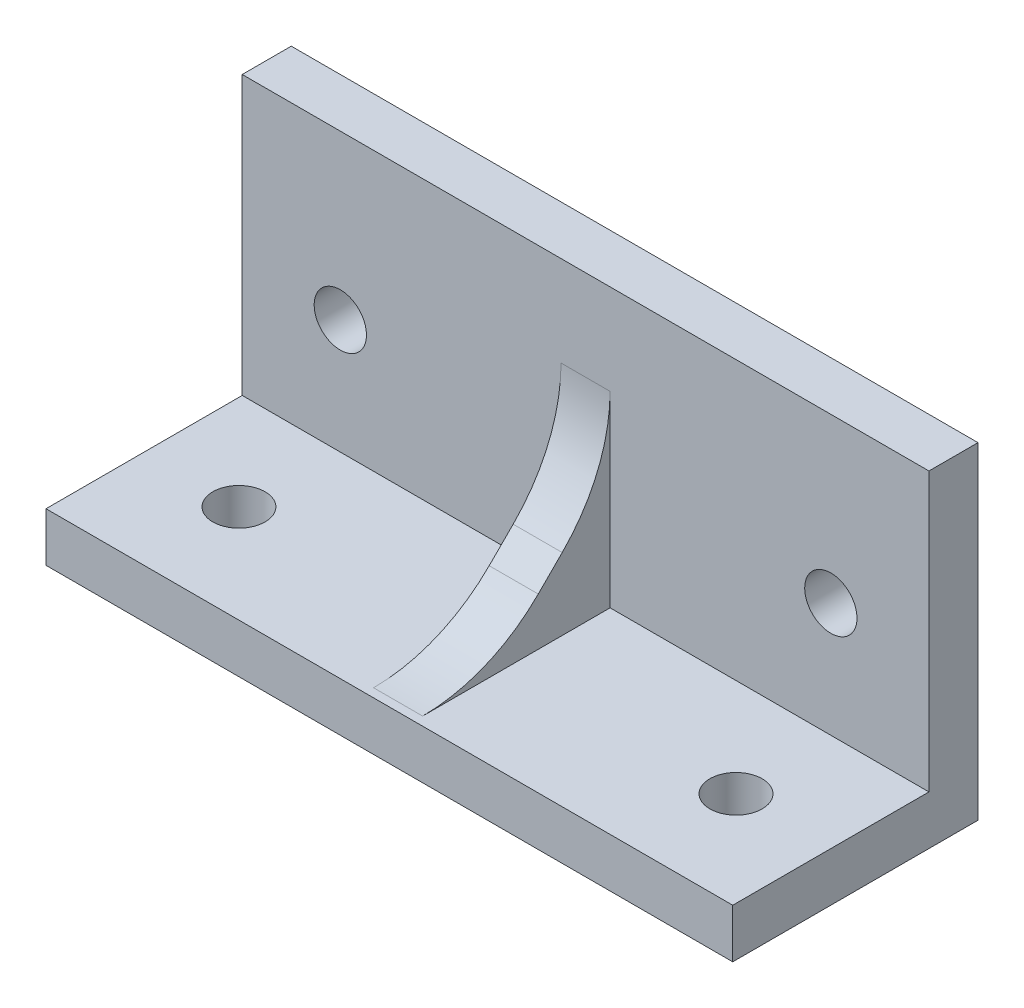
ISO-10303-21;
HEADER;
FILE_DESCRIPTION(('STEP AP214'),'2;1');
FILE_NAME('part.step','',(''),(''),'','','');
FILE_SCHEMA(('AUTOMOTIVE_DESIGN { 1 0 10303 214 1 1 1 1 }'));
ENDSEC;
DATA;
#1=APPLICATION_CONTEXT('core data for automotive mechanical design processes');
#2=APPLICATION_PROTOCOL_DEFINITION('international standard','automotive_design',2000,#1);
#3=PRODUCT_CONTEXT('',#1,'mechanical');
#4=PRODUCT('Part','Part','',(#3));
#5=PRODUCT_RELATED_PRODUCT_CATEGORY('part','',(#4));
#6=PRODUCT_DEFINITION_FORMATION('','',#4);
#7=PRODUCT_DEFINITION_CONTEXT('part definition',#1,'design');
#8=PRODUCT_DEFINITION('design','',#6,#7);
#9=PRODUCT_DEFINITION_SHAPE('','',#8);
#10=(LENGTH_UNIT() NAMED_UNIT(*) SI_UNIT(.MILLI.,.METRE.));
#11=(NAMED_UNIT(*) PLANE_ANGLE_UNIT() SI_UNIT($,.RADIAN.));
#12=(NAMED_UNIT(*) SI_UNIT($,.STERADIAN.) SOLID_ANGLE_UNIT());
#13=UNCERTAINTY_MEASURE_WITH_UNIT(LENGTH_MEASURE(1.E-05),#10,'distance_accuracy_value','');
#14=(GEOMETRIC_REPRESENTATION_CONTEXT(3) GLOBAL_UNCERTAINTY_ASSIGNED_CONTEXT((#13)) GLOBAL_UNIT_ASSIGNED_CONTEXT((#10,
#11,#12)) REPRESENTATION_CONTEXT('',''));
#15=CARTESIAN_POINT('',(0.,0.,0.));
#16=DIRECTION('',(0.,0.,1.));
#17=DIRECTION('',(1.,0.,0.));
#18=AXIS2_PLACEMENT_3D('',#15,#16,#17);
#19=CARTESIAN_POINT('',(0.,3.,15.));
#20=DIRECTION('',(0.,-1.,0.));
#21=DIRECTION('',(0.,0.,-1.));
#22=AXIS2_PLACEMENT_3D('',#19,#20,#21);
#23=PLANE('',#22);
#24=CARTESIAN_POINT('',(5.8,3.,9.00000000000001));
#25=DIRECTION('',(0.,1.,0.));
#26=DIRECTION('',(0.,0.,1.));
#27=AXIS2_PLACEMENT_3D('',#24,#25,#26);
#28=CIRCLE('',#27,1.6);
#29=CARTESIAN_POINT('',(5.8,3.,10.6));
#30=VERTEX_POINT('',#29);
#31=EDGE_CURVE('E224',#30,#30,#28,.T.);
#32=ORIENTED_EDGE('',*,*,#31,.F.);
#33=EDGE_LOOP('',(#32));
#34=FACE_BOUND('',#33,.T.);
#35=CARTESIAN_POINT('',(36.2,3.,9.00000000000001));
#36=DIRECTION('',(0.,1.,0.));
#37=DIRECTION('',(0.,0.,1.));
#38=AXIS2_PLACEMENT_3D('',#35,#36,#37);
#39=CIRCLE('',#38,1.6);
#40=CARTESIAN_POINT('',(36.2,3.,10.6));
#41=VERTEX_POINT('',#40);
#42=EDGE_CURVE('E219',#41,#41,#39,.T.);
#43=ORIENTED_EDGE('',*,*,#42,.F.);
#44=EDGE_LOOP('',(#43));
#45=FACE_BOUND('',#44,.T.);
#46=DIRECTION('',(0.,0.,1.));
#47=VECTOR('',#46,1.);
#48=CARTESIAN_POINT('',(22.5,3.,10.3239682850573));
#49=LINE('',#48,#47);
#50=CARTESIAN_POINT('',(22.5,3.,3.));
#51=VERTEX_POINT('',#50);
#52=CARTESIAN_POINT('',(22.5,3.,14.4661039087882));
#53=VERTEX_POINT('',#52);
#54=EDGE_CURVE('E48',#51,#53,#49,.T.);
#55=ORIENTED_EDGE('',*,*,#54,.T.);
#56=DIRECTION('',(1.,0.,0.));
#57=VECTOR('',#56,1.);
#58=CARTESIAN_POINT('',(19.5,3.,14.4661039087882));
#59=LINE('',#58,#57);
#60=CARTESIAN_POINT('',(19.5,3.,14.4661039087882));
#61=VERTEX_POINT('',#60);
#62=EDGE_CURVE('E181',#53,#61,#59,.F.);
#63=ORIENTED_EDGE('',*,*,#62,.T.);
#64=DIRECTION('',(0.,0.,1.));
#65=VECTOR('',#64,1.);
#66=CARTESIAN_POINT('',(19.5,3.,10.3239682850573));
#67=LINE('',#66,#65);
#68=CARTESIAN_POINT('',(19.5,3.,3.));
#69=VERTEX_POINT('',#68);
#70=EDGE_CURVE('E55',#69,#61,#67,.T.);
#71=ORIENTED_EDGE('',*,*,#70,.F.);
#72=DIRECTION('',(1.,0.,0.));
#73=VECTOR('',#72,1.);
#74=CARTESIAN_POINT('',(0.,3.,3.));
#75=LINE('',#74,#73);
#76=CARTESIAN_POINT('',(0.,3.,3.));
#77=VERTEX_POINT('',#76);
#78=EDGE_CURVE('E138',#77,#69,#75,.T.);
#79=ORIENTED_EDGE('',*,*,#78,.F.);
#80=DIRECTION('',(0.,0.,-1.));
#81=VECTOR('',#80,1.);
#82=CARTESIAN_POINT('',(0.,3.,15.));
#83=LINE('',#82,#81);
#84=CARTESIAN_POINT('',(0.,3.,15.));
#85=VERTEX_POINT('',#84);
#86=EDGE_CURVE('E144',#85,#77,#83,.T.);
#87=ORIENTED_EDGE('',*,*,#86,.F.);
#88=DIRECTION('',(-1.,0.,0.));
#89=VECTOR('',#88,1.);
#90=CARTESIAN_POINT('',(0.,3.,15.));
#91=LINE('',#90,#89);
#92=CARTESIAN_POINT('',(42.,3.,15.));
#93=VERTEX_POINT('',#92);
#94=EDGE_CURVE('E160',#93,#85,#91,.T.);
#95=ORIENTED_EDGE('',*,*,#94,.F.);
#96=DIRECTION('',(0.,0.,-1.));
#97=VECTOR('',#96,1.);
#98=CARTESIAN_POINT('',(42.,3.,15.));
#99=LINE('',#98,#97);
#100=CARTESIAN_POINT('',(42.,3.,3.));
#101=VERTEX_POINT('',#100);
#102=EDGE_CURVE('E165',#93,#101,#99,.T.);
#103=ORIENTED_EDGE('',*,*,#102,.T.);
#104=EDGE_CURVE('E199',#51,#101,#75,.T.);
#105=ORIENTED_EDGE('',*,*,#104,.F.);
#106=EDGE_LOOP('',(#55,#63,#71,#79,#87,#95,#103,#105));
#107=FACE_BOUND('',#106,.T.);
#108=ADVANCED_FACE('F33',(#34,#45,#107),#23,.F.);
#109=CARTESIAN_POINT('',(0.,0.,15.));
#110=DIRECTION('',(1.,0.,0.));
#111=DIRECTION('',(0.,0.,-1.));
#112=AXIS2_PLACEMENT_3D('',#109,#110,#111);
#113=PLANE('',#112);
#114=DIRECTION('',(0.,-1.,0.));
#115=VECTOR('',#114,1.);
#116=CARTESIAN_POINT('',(0.,0.,0.));
#117=LINE('',#116,#115);
#118=CARTESIAN_POINT('',(0.,20.,0.));
#119=VERTEX_POINT('',#118);
#120=CARTESIAN_POINT('',(0.,0.,0.));
#121=VERTEX_POINT('',#120);
#122=EDGE_CURVE('E145',#119,#121,#117,.T.);
#123=ORIENTED_EDGE('',*,*,#122,.T.);
#124=DIRECTION('',(0.,0.,-1.));
#125=VECTOR('',#124,1.);
#126=CARTESIAN_POINT('',(0.,0.,15.));
#127=LINE('',#126,#125);
#128=CARTESIAN_POINT('',(0.,0.,15.));
#129=VERTEX_POINT('',#128);
#130=EDGE_CURVE('E171',#129,#121,#127,.T.);
#131=ORIENTED_EDGE('',*,*,#130,.F.);
#132=DIRECTION('',(0.,-1.,0.));
#133=VECTOR('',#132,1.);
#134=CARTESIAN_POINT('',(0.,0.,15.));
#135=LINE('',#134,#133);
#136=EDGE_CURVE('E152',#85,#129,#135,.T.);
#137=ORIENTED_EDGE('',*,*,#136,.F.);
#138=ORIENTED_EDGE('',*,*,#86,.T.);
#139=DIRECTION('',(0.,-1.,0.));
#140=VECTOR('',#139,1.);
#141=CARTESIAN_POINT('',(0.,20.,3.));
#142=LINE('',#141,#140);
#143=CARTESIAN_POINT('',(0.,20.,3.));
#144=VERTEX_POINT('',#143);
#145=EDGE_CURVE('E122',#144,#77,#142,.T.);
#146=ORIENTED_EDGE('',*,*,#145,.F.);
#147=DIRECTION('',(0.,0.,1.));
#148=VECTOR('',#147,1.);
#149=CARTESIAN_POINT('',(0.,20.,0.));
#150=LINE('',#149,#148);
#151=EDGE_CURVE('E129',#119,#144,#150,.T.);
#152=ORIENTED_EDGE('',*,*,#151,.F.);
#153=EDGE_LOOP('',(#123,#131,#137,#138,#146,#152));
#154=FACE_BOUND('',#153,.T.);
#155=ADVANCED_FACE('F141',(#154),#113,.F.);
#156=CARTESIAN_POINT('',(0.,0.,15.));
#157=DIRECTION('',(0.,1.,0.));
#158=DIRECTION('',(0.,0.,1.));
#159=AXIS2_PLACEMENT_3D('',#156,#157,#158);
#160=PLANE('',#159);
#161=CARTESIAN_POINT('',(5.8,0.,9.00000000000001));
#162=DIRECTION('',(0.,1.,0.));
#163=DIRECTION('',(0.,0.,1.));
#164=AXIS2_PLACEMENT_3D('',#161,#162,#163);
#165=CIRCLE('',#164,1.6);
#166=CARTESIAN_POINT('',(5.8,0.,10.6));
#167=VERTEX_POINT('',#166);
#168=EDGE_CURVE('E227',#167,#167,#165,.F.);
#169=ORIENTED_EDGE('',*,*,#168,.F.);
#170=EDGE_LOOP('',(#169));
#171=FACE_BOUND('',#170,.T.);
#172=CARTESIAN_POINT('',(36.2,0.,9.00000000000001));
#173=DIRECTION('',(0.,1.,0.));
#174=DIRECTION('',(0.,0.,1.));
#175=AXIS2_PLACEMENT_3D('',#172,#173,#174);
#176=CIRCLE('',#175,1.6);
#177=CARTESIAN_POINT('',(36.2,0.,10.6));
#178=VERTEX_POINT('',#177);
#179=EDGE_CURVE('E228',#178,#178,#176,.F.);
#180=ORIENTED_EDGE('',*,*,#179,.F.);
#181=EDGE_LOOP('',(#180));
#182=FACE_BOUND('',#181,.T.);
#183=DIRECTION('',(1.,0.,0.));
#184=VECTOR('',#183,1.);
#185=CARTESIAN_POINT('',(0.,0.,0.));
#186=LINE('',#185,#184);
#187=CARTESIAN_POINT('',(42.,0.,0.));
#188=VERTEX_POINT('',#187);
#189=EDGE_CURVE('E147',#121,#188,#186,.T.);
#190=ORIENTED_EDGE('',*,*,#189,.T.);
#191=DIRECTION('',(0.,0.,-1.));
#192=VECTOR('',#191,1.);
#193=CARTESIAN_POINT('',(42.,0.,15.));
#194=LINE('',#193,#192);
#195=CARTESIAN_POINT('',(42.,0.,15.));
#196=VERTEX_POINT('',#195);
#197=EDGE_CURVE('E168',#196,#188,#194,.T.);
#198=ORIENTED_EDGE('',*,*,#197,.F.);
#199=DIRECTION('',(1.,0.,0.));
#200=VECTOR('',#199,1.);
#201=CARTESIAN_POINT('',(0.,0.,15.));
#202=LINE('',#201,#200);
#203=EDGE_CURVE('E155',#129,#196,#202,.T.);
#204=ORIENTED_EDGE('',*,*,#203,.F.);
#205=ORIENTED_EDGE('',*,*,#130,.T.);
#206=EDGE_LOOP('',(#190,#198,#204,#205));
#207=FACE_BOUND('',#206,.T.);
#208=ADVANCED_FACE('F242',(#171,#182,#207),#160,.F.);
#209=CARTESIAN_POINT('',(42.,0.,15.));
#210=DIRECTION('',(-1.,0.,0.));
#211=DIRECTION('',(0.,0.,1.));
#212=AXIS2_PLACEMENT_3D('',#209,#210,#211);
#213=PLANE('',#212);
#214=DIRECTION('',(0.,1.,0.));
#215=VECTOR('',#214,1.);
#216=CARTESIAN_POINT('',(42.,0.,0.));
#217=LINE('',#216,#215);
#218=CARTESIAN_POINT('',(42.,20.,0.));
#219=VERTEX_POINT('',#218);
#220=EDGE_CURVE('E156',#188,#219,#217,.T.);
#221=ORIENTED_EDGE('',*,*,#220,.T.);
#222=DIRECTION('',(0.,0.,-1.));
#223=VECTOR('',#222,1.);
#224=CARTESIAN_POINT('',(42.,20.,0.));
#225=LINE('',#224,#223);
#226=CARTESIAN_POINT('',(42.,20.,3.));
#227=VERTEX_POINT('',#226);
#228=EDGE_CURVE('E128',#227,#219,#225,.T.);
#229=ORIENTED_EDGE('',*,*,#228,.F.);
#230=DIRECTION('',(0.,-1.,0.));
#231=VECTOR('',#230,1.);
#232=CARTESIAN_POINT('',(42.,20.,3.));
#233=LINE('',#232,#231);
#234=EDGE_CURVE('E124',#227,#101,#233,.T.);
#235=ORIENTED_EDGE('',*,*,#234,.T.);
#236=ORIENTED_EDGE('',*,*,#102,.F.);
#237=DIRECTION('',(0.,1.,0.));
#238=VECTOR('',#237,1.);
#239=CARTESIAN_POINT('',(42.,0.,15.));
#240=LINE('',#239,#238);
#241=EDGE_CURVE('E158',#196,#93,#240,.T.);
#242=ORIENTED_EDGE('',*,*,#241,.F.);
#243=ORIENTED_EDGE('',*,*,#197,.T.);
#244=EDGE_LOOP('',(#221,#229,#235,#236,#242,#243));
#245=FACE_BOUND('',#244,.T.);
#246=ADVANCED_FACE('F249',(#245),#213,.F.);
#247=CARTESIAN_POINT('',(0.,0.,15.));
#248=DIRECTION('',(0.,0.,-1.));
#249=DIRECTION('',(-1.,0.,0.));
#250=AXIS2_PLACEMENT_3D('',#247,#248,#249);
#251=PLANE('',#250);
#252=ORIENTED_EDGE('',*,*,#136,.T.);
#253=ORIENTED_EDGE('',*,*,#203,.T.);
#254=ORIENTED_EDGE('',*,*,#241,.T.);
#255=ORIENTED_EDGE('',*,*,#94,.T.);
#256=EDGE_LOOP('',(#252,#253,#254,#255));
#257=FACE_BOUND('',#256,.T.);
#258=ADVANCED_FACE('F246',(#257),#251,.F.);
#259=CARTESIAN_POINT('',(0.,0.,0.));
#260=DIRECTION('',(0.,0.,-1.));
#261=DIRECTION('',(-1.,0.,0.));
#262=AXIS2_PLACEMENT_3D('',#259,#260,#261);
#263=PLANE('',#262);
#264=CARTESIAN_POINT('',(36.,10.,0.));
#265=DIRECTION('',(0.,0.,-1.));
#266=DIRECTION('',(-1.,0.,0.));
#267=AXIS2_PLACEMENT_3D('',#264,#265,#266);
#268=CIRCLE('',#267,1.6);
#269=CARTESIAN_POINT('',(34.4,10.,0.));
#270=VERTEX_POINT('',#269);
#271=EDGE_CURVE('E212',#270,#270,#268,.T.);
#272=ORIENTED_EDGE('',*,*,#271,.F.);
#273=EDGE_LOOP('',(#272));
#274=FACE_BOUND('',#273,.T.);
#275=CARTESIAN_POINT('',(6.,10.,0.));
#276=DIRECTION('',(0.,0.,-1.));
#277=DIRECTION('',(-1.,0.,0.));
#278=AXIS2_PLACEMENT_3D('',#275,#276,#277);
#279=CIRCLE('',#278,1.6);
#280=CARTESIAN_POINT('',(4.4,10.,0.));
#281=VERTEX_POINT('',#280);
#282=EDGE_CURVE('E208',#281,#281,#279,.T.);
#283=ORIENTED_EDGE('',*,*,#282,.F.);
#284=EDGE_LOOP('',(#283));
#285=FACE_BOUND('',#284,.T.);
#286=ORIENTED_EDGE('',*,*,#122,.F.);
#287=DIRECTION('',(-1.,0.,0.));
#288=VECTOR('',#287,1.);
#289=CARTESIAN_POINT('',(0.,20.,0.));
#290=LINE('',#289,#288);
#291=EDGE_CURVE('E135',#219,#119,#290,.T.);
#292=ORIENTED_EDGE('',*,*,#291,.F.);
#293=ORIENTED_EDGE('',*,*,#220,.F.);
#294=ORIENTED_EDGE('',*,*,#189,.F.);
#295=EDGE_LOOP('',(#286,#292,#293,#294));
#296=FACE_BOUND('',#295,.T.);
#297=ADVANCED_FACE('F239',(#274,#285,#296),#263,.T.);
#298=CARTESIAN_POINT('',(0.,20.,3.));
#299=DIRECTION('',(0.,0.,-1.));
#300=DIRECTION('',(-1.,0.,0.));
#301=AXIS2_PLACEMENT_3D('',#298,#299,#300);
#302=PLANE('',#301);
#303=CARTESIAN_POINT('',(36.,10.,3.));
#304=DIRECTION('',(0.,0.,-1.));
#305=DIRECTION('',(-1.,0.,0.));
#306=AXIS2_PLACEMENT_3D('',#303,#304,#305);
#307=CIRCLE('',#306,1.6);
#308=CARTESIAN_POINT('',(34.4,10.,3.));
#309=VERTEX_POINT('',#308);
#310=EDGE_CURVE('E215',#309,#309,#307,.F.);
#311=ORIENTED_EDGE('',*,*,#310,.F.);
#312=EDGE_LOOP('',(#311));
#313=FACE_BOUND('',#312,.T.);
#314=CARTESIAN_POINT('',(6.,10.,3.));
#315=DIRECTION('',(0.,0.,-1.));
#316=DIRECTION('',(-1.,0.,0.));
#317=AXIS2_PLACEMENT_3D('',#314,#315,#316);
#318=CIRCLE('',#317,1.6);
#319=CARTESIAN_POINT('',(4.4,10.,3.));
#320=VERTEX_POINT('',#319);
#321=EDGE_CURVE('E216',#320,#320,#318,.F.);
#322=ORIENTED_EDGE('',*,*,#321,.F.);
#323=EDGE_LOOP('',(#322));
#324=FACE_BOUND('',#323,.T.);
#325=DIRECTION('',(1.,0.,0.));
#326=VECTOR('',#325,1.);
#327=CARTESIAN_POINT('',(22.5,14.4661039087882,3.));
#328=LINE('',#327,#326);
#329=CARTESIAN_POINT('',(19.5,14.4661039087882,3.));
#330=VERTEX_POINT('',#329);
#331=CARTESIAN_POINT('',(22.5,14.4661039087882,3.));
#332=VERTEX_POINT('',#331);
#333=EDGE_CURVE('E174',#330,#332,#328,.T.);
#334=ORIENTED_EDGE('',*,*,#333,.T.);
#335=DIRECTION('',(0.,-1.,0.));
#336=VECTOR('',#335,1.);
#337=CARTESIAN_POINT('',(22.5,3.,3.));
#338=LINE('',#337,#336);
#339=EDGE_CURVE('E209',#332,#51,#338,.T.);
#340=ORIENTED_EDGE('',*,*,#339,.T.);
#341=ORIENTED_EDGE('',*,*,#104,.T.);
#342=ORIENTED_EDGE('',*,*,#234,.F.);
#343=DIRECTION('',(1.,0.,0.));
#344=VECTOR('',#343,1.);
#345=CARTESIAN_POINT('',(0.,20.,3.));
#346=LINE('',#345,#344);
#347=EDGE_CURVE('E116',#144,#227,#346,.T.);
#348=ORIENTED_EDGE('',*,*,#347,.F.);
#349=ORIENTED_EDGE('',*,*,#145,.T.);
#350=ORIENTED_EDGE('',*,*,#78,.T.);
#351=DIRECTION('',(0.,-1.,0.));
#352=VECTOR('',#351,1.);
#353=CARTESIAN_POINT('',(19.5,3.,3.));
#354=LINE('',#353,#352);
#355=EDGE_CURVE('E197',#330,#69,#354,.T.);
#356=ORIENTED_EDGE('',*,*,#355,.F.);
#357=EDGE_LOOP('',(#334,#340,#341,#342,#348,#349,#350,#356));
#358=FACE_BOUND('',#357,.T.);
#359=ADVANCED_FACE('F119',(#313,#324,#358),#302,.F.);
#360=CARTESIAN_POINT('',(0.,20.,0.));
#361=DIRECTION('',(0.,1.,0.));
#362=DIRECTION('',(0.,0.,1.));
#363=AXIS2_PLACEMENT_3D('',#360,#361,#362);
#364=PLANE('',#363);
#365=ORIENTED_EDGE('',*,*,#151,.T.);
#366=ORIENTED_EDGE('',*,*,#347,.T.);
#367=ORIENTED_EDGE('',*,*,#228,.T.);
#368=ORIENTED_EDGE('',*,*,#291,.T.);
#369=EDGE_LOOP('',(#365,#366,#367,#368));
#370=FACE_BOUND('',#369,.T.);
#371=ADVANCED_FACE('F133',(#370),#364,.T.);
#372=CARTESIAN_POINT('',(36.2,-0.00100000000000013,9.00000000000001));
#373=DIRECTION('',(0.,1.,0.));
#374=DIRECTION('',(0.,0.,1.));
#375=AXIS2_PLACEMENT_3D('',#372,#373,#374);
#376=CYLINDRICAL_SURFACE('',#375,1.6);
#377=CARTESIAN_POINT('',(36.2,3.,10.6));
#378=CARTESIAN_POINT('',(36.2,2.96875,10.6));
#379=CARTESIAN_POINT('',(36.2,2.9375,10.6));
#380=CARTESIAN_POINT('',(36.2,2.875,10.6));
#381=CARTESIAN_POINT('',(36.2,2.84375,10.6));
#382=CARTESIAN_POINT('',(36.2,2.78125,10.6));
#383=CARTESIAN_POINT('',(36.2,2.75,10.6));
#384=CARTESIAN_POINT('',(36.2,2.6875,10.6));
#385=CARTESIAN_POINT('',(36.2,2.65625,10.6));
#386=CARTESIAN_POINT('',(36.2,2.59375,10.6));
#387=CARTESIAN_POINT('',(36.2,2.5625,10.6));
#388=CARTESIAN_POINT('',(36.2,2.5,10.6));
#389=CARTESIAN_POINT('',(36.2,2.46875,10.6));
#390=CARTESIAN_POINT('',(36.2,2.40625,10.6));
#391=CARTESIAN_POINT('',(36.2,2.375,10.6));
#392=CARTESIAN_POINT('',(36.2,2.3125,10.6));
#393=CARTESIAN_POINT('',(36.2,2.28125,10.6));
#394=CARTESIAN_POINT('',(36.2,2.21875,10.6));
#395=CARTESIAN_POINT('',(36.2,2.1875,10.6));
#396=CARTESIAN_POINT('',(36.2,2.125,10.6));
#397=CARTESIAN_POINT('',(36.2,2.09375,10.6));
#398=CARTESIAN_POINT('',(36.2,2.03125,10.6));
#399=CARTESIAN_POINT('',(36.2,2.,10.6));
#400=CARTESIAN_POINT('',(36.2,1.9375,10.6));
#401=CARTESIAN_POINT('',(36.2,1.90625,10.6));
#402=CARTESIAN_POINT('',(36.2,1.84375,10.6));
#403=CARTESIAN_POINT('',(36.2,1.8125,10.6));
#404=CARTESIAN_POINT('',(36.2,1.75,10.6));
#405=CARTESIAN_POINT('',(36.2,1.71875,10.6));
#406=CARTESIAN_POINT('',(36.2,1.65625,10.6));
#407=CARTESIAN_POINT('',(36.2,1.625,10.6));
#408=CARTESIAN_POINT('',(36.2,1.5625,10.6));
#409=CARTESIAN_POINT('',(36.2,1.53125,10.6));
#410=CARTESIAN_POINT('',(36.2,1.46875,10.6));
#411=CARTESIAN_POINT('',(36.2,1.4375,10.6));
#412=CARTESIAN_POINT('',(36.2,1.375,10.6));
#413=CARTESIAN_POINT('',(36.2,1.34375,10.6));
#414=CARTESIAN_POINT('',(36.2,1.28125,10.6));
#415=CARTESIAN_POINT('',(36.2,1.25,10.6));
#416=CARTESIAN_POINT('',(36.2,1.1875,10.6));
#417=CARTESIAN_POINT('',(36.2,1.15625,10.6));
#418=CARTESIAN_POINT('',(36.2,1.09375,10.6));
#419=CARTESIAN_POINT('',(36.2,1.0625,10.6));
#420=CARTESIAN_POINT('',(36.2,1.,10.6));
#421=CARTESIAN_POINT('',(36.2,0.96875,10.6));
#422=CARTESIAN_POINT('',(36.2,0.90625,10.6));
#423=CARTESIAN_POINT('',(36.2,0.875,10.6));
#424=CARTESIAN_POINT('',(36.2,0.8125,10.6));
#425=CARTESIAN_POINT('',(36.2,0.78125,10.6));
#426=CARTESIAN_POINT('',(36.2,0.71875,10.6));
#427=CARTESIAN_POINT('',(36.2,0.6875,10.6));
#428=CARTESIAN_POINT('',(36.2,0.625,10.6));
#429=CARTESIAN_POINT('',(36.2,0.59375,10.6));
#430=CARTESIAN_POINT('',(36.2,0.53125,10.6));
#431=CARTESIAN_POINT('',(36.2,0.5,10.6));
#432=CARTESIAN_POINT('',(36.2,0.4375,10.6));
#433=CARTESIAN_POINT('',(36.2,0.40625,10.6));
#434=CARTESIAN_POINT('',(36.2,0.34375,10.6));
#435=CARTESIAN_POINT('',(36.2,0.3125,10.6));
#436=CARTESIAN_POINT('',(36.2,0.25,10.6));
#437=CARTESIAN_POINT('',(36.2,0.21875,10.6));
#438=CARTESIAN_POINT('',(36.2,0.15625,10.6));
#439=CARTESIAN_POINT('',(36.2,0.125,10.6));
#440=CARTESIAN_POINT('',(36.2,0.0625000000000001,10.6));
#441=CARTESIAN_POINT('',(36.2,0.0312500000000001,10.6));
#442=CARTESIAN_POINT('',(36.2,0.,10.6));
#443=B_SPLINE_CURVE_WITH_KNOTS('',3,(#377,#378,#379,#380,#381,#382,#383,#384,#385,#386,#387,
#388,#389,#390,#391,#392,#393,#394,#395,#396,#397,#398,#399,#400,#401,#402,#403,#404,#405,#406,
#407,#408,#409,#410,#411,#412,#413,#414,#415,#416,#417,#418,#419,#420,#421,#422,#423,#424,#425,
#426,#427,#428,#429,#430,#431,#432,#433,#434,#435,#436,#437,#438,#439,#440,#441,#442),
.UNSPECIFIED.,.F.,.F.,(4,2,2,2,2,2,2,2,2,2,2,2,2,2,2,2,2,2,2,2,2,2,2,2,2,2,2,2,2,2,2,2,4),(0.,
0.0937500000000001,0.1875,0.28125,0.375,0.46875,0.5625,0.65625,0.75,0.84375,0.9375,1.03125,
1.125,1.21875,1.3125,1.40625,1.5,1.59375,1.6875,1.78125,1.875,1.96875,2.0625,2.15625,2.25,
2.34375,2.4375,2.53125,2.625,2.71875,2.8125,2.90625,3.),.UNSPECIFIED.);
#444=EDGE_CURVE('BSEAM278',#41,#178,#443,.T.);
#445=ORIENTED_EDGE('',*,*,#42,.T.);
#446=ORIENTED_EDGE('',*,*,#179,.T.);
#447=ORIENTED_EDGE('',*,*,#444,.T.);
#448=ORIENTED_EDGE('',*,*,#444,.F.);
#449=EDGE_LOOP('',(#445,#447,#446,#448));
#450=FACE_BOUND('',#449,.T.);
#451=ADVANCED_FACE('F278',(#450),#376,.F.);
#452=CARTESIAN_POINT('',(5.8,-0.00100000000000013,9.00000000000001));
#453=DIRECTION('',(0.,1.,0.));
#454=DIRECTION('',(0.,0.,1.));
#455=AXIS2_PLACEMENT_3D('',#452,#453,#454);
#456=CYLINDRICAL_SURFACE('',#455,1.6);
#457=CARTESIAN_POINT('',(5.8,3.,10.6));
#458=CARTESIAN_POINT('',(5.8,2.96875,10.6));
#459=CARTESIAN_POINT('',(5.8,2.9375,10.6));
#460=CARTESIAN_POINT('',(5.8,2.875,10.6));
#461=CARTESIAN_POINT('',(5.8,2.84375,10.6));
#462=CARTESIAN_POINT('',(5.8,2.78125,10.6));
#463=CARTESIAN_POINT('',(5.8,2.75,10.6));
#464=CARTESIAN_POINT('',(5.8,2.6875,10.6));
#465=CARTESIAN_POINT('',(5.8,2.65625,10.6));
#466=CARTESIAN_POINT('',(5.8,2.59375,10.6));
#467=CARTESIAN_POINT('',(5.8,2.5625,10.6));
#468=CARTESIAN_POINT('',(5.8,2.5,10.6));
#469=CARTESIAN_POINT('',(5.8,2.46875,10.6));
#470=CARTESIAN_POINT('',(5.8,2.40625,10.6));
#471=CARTESIAN_POINT('',(5.8,2.375,10.6));
#472=CARTESIAN_POINT('',(5.8,2.3125,10.6));
#473=CARTESIAN_POINT('',(5.8,2.28125,10.6));
#474=CARTESIAN_POINT('',(5.8,2.21875,10.6));
#475=CARTESIAN_POINT('',(5.8,2.1875,10.6));
#476=CARTESIAN_POINT('',(5.8,2.125,10.6));
#477=CARTESIAN_POINT('',(5.8,2.09375,10.6));
#478=CARTESIAN_POINT('',(5.8,2.03125,10.6));
#479=CARTESIAN_POINT('',(5.8,2.,10.6));
#480=CARTESIAN_POINT('',(5.8,1.9375,10.6));
#481=CARTESIAN_POINT('',(5.8,1.90625,10.6));
#482=CARTESIAN_POINT('',(5.8,1.84375,10.6));
#483=CARTESIAN_POINT('',(5.8,1.8125,10.6));
#484=CARTESIAN_POINT('',(5.8,1.75,10.6));
#485=CARTESIAN_POINT('',(5.8,1.71875,10.6));
#486=CARTESIAN_POINT('',(5.8,1.65625,10.6));
#487=CARTESIAN_POINT('',(5.8,1.625,10.6));
#488=CARTESIAN_POINT('',(5.8,1.5625,10.6));
#489=CARTESIAN_POINT('',(5.8,1.53125,10.6));
#490=CARTESIAN_POINT('',(5.8,1.46875,10.6));
#491=CARTESIAN_POINT('',(5.8,1.4375,10.6));
#492=CARTESIAN_POINT('',(5.8,1.375,10.6));
#493=CARTESIAN_POINT('',(5.8,1.34375,10.6));
#494=CARTESIAN_POINT('',(5.8,1.28125,10.6));
#495=CARTESIAN_POINT('',(5.8,1.25,10.6));
#496=CARTESIAN_POINT('',(5.8,1.1875,10.6));
#497=CARTESIAN_POINT('',(5.8,1.15625,10.6));
#498=CARTESIAN_POINT('',(5.8,1.09375,10.6));
#499=CARTESIAN_POINT('',(5.8,1.0625,10.6));
#500=CARTESIAN_POINT('',(5.8,1.,10.6));
#501=CARTESIAN_POINT('',(5.8,0.96875,10.6));
#502=CARTESIAN_POINT('',(5.8,0.90625,10.6));
#503=CARTESIAN_POINT('',(5.8,0.875,10.6));
#504=CARTESIAN_POINT('',(5.8,0.8125,10.6));
#505=CARTESIAN_POINT('',(5.8,0.78125,10.6));
#506=CARTESIAN_POINT('',(5.8,0.71875,10.6));
#507=CARTESIAN_POINT('',(5.8,0.6875,10.6));
#508=CARTESIAN_POINT('',(5.8,0.625,10.6));
#509=CARTESIAN_POINT('',(5.8,0.59375,10.6));
#510=CARTESIAN_POINT('',(5.8,0.53125,10.6));
#511=CARTESIAN_POINT('',(5.8,0.5,10.6));
#512=CARTESIAN_POINT('',(5.8,0.4375,10.6));
#513=CARTESIAN_POINT('',(5.8,0.40625,10.6));
#514=CARTESIAN_POINT('',(5.8,0.34375,10.6));
#515=CARTESIAN_POINT('',(5.8,0.3125,10.6));
#516=CARTESIAN_POINT('',(5.8,0.25,10.6));
#517=CARTESIAN_POINT('',(5.8,0.21875,10.6));
#518=CARTESIAN_POINT('',(5.8,0.15625,10.6));
#519=CARTESIAN_POINT('',(5.8,0.125,10.6));
#520=CARTESIAN_POINT('',(5.8,0.0625000000000001,10.6));
#521=CARTESIAN_POINT('',(5.8,0.0312500000000001,10.6));
#522=CARTESIAN_POINT('',(5.8,0.,10.6));
#523=B_SPLINE_CURVE_WITH_KNOTS('',3,(#457,#458,#459,#460,#461,#462,#463,#464,#465,#466,#467,
#468,#469,#470,#471,#472,#473,#474,#475,#476,#477,#478,#479,#480,#481,#482,#483,#484,#485,#486,
#487,#488,#489,#490,#491,#492,#493,#494,#495,#496,#497,#498,#499,#500,#501,#502,#503,#504,#505,
#506,#507,#508,#509,#510,#511,#512,#513,#514,#515,#516,#517,#518,#519,#520,#521,#522),
.UNSPECIFIED.,.F.,.F.,(4,2,2,2,2,2,2,2,2,2,2,2,2,2,2,2,2,2,2,2,2,2,2,2,2,2,2,2,2,2,2,2,4),(0.,
0.0937500000000001,0.1875,0.28125,0.375,0.46875,0.5625,0.65625,0.75,0.84375,0.9375,1.03125,
1.125,1.21875,1.3125,1.40625,1.5,1.59375,1.6875,1.78125,1.875,1.96875,2.0625,2.15625,2.25,
2.34375,2.4375,2.53125,2.625,2.71875,2.8125,2.90625,3.),.UNSPECIFIED.);
#524=EDGE_CURVE('BSEAM281',#30,#167,#523,.T.);
#525=ORIENTED_EDGE('',*,*,#31,.T.);
#526=ORIENTED_EDGE('',*,*,#168,.T.);
#527=ORIENTED_EDGE('',*,*,#524,.T.);
#528=ORIENTED_EDGE('',*,*,#524,.F.);
#529=EDGE_LOOP('',(#525,#527,#526,#528));
#530=FACE_BOUND('',#529,.T.);
#531=ADVANCED_FACE('F281',(#530),#456,.F.);
#532=CARTESIAN_POINT('',(6.,10.,15.001));
#533=DIRECTION('',(0.,0.,-1.));
#534=DIRECTION('',(-1.,0.,0.));
#535=AXIS2_PLACEMENT_3D('',#532,#533,#534);
#536=CYLINDRICAL_SURFACE('',#535,1.6);
#537=CARTESIAN_POINT('',(4.4,10.,0.));
#538=CARTESIAN_POINT('',(4.4,10.,0.03125));
#539=CARTESIAN_POINT('',(4.4,10.,0.0625000000000001));
#540=CARTESIAN_POINT('',(4.4,10.,0.125));
#541=CARTESIAN_POINT('',(4.4,10.,0.15625));
#542=CARTESIAN_POINT('',(4.4,10.,0.21875));
#543=CARTESIAN_POINT('',(4.4,10.,0.25));
#544=CARTESIAN_POINT('',(4.4,10.,0.3125));
#545=CARTESIAN_POINT('',(4.4,10.,0.34375));
#546=CARTESIAN_POINT('',(4.4,10.,0.40625));
#547=CARTESIAN_POINT('',(4.4,10.,0.4375));
#548=CARTESIAN_POINT('',(4.4,10.,0.5));
#549=CARTESIAN_POINT('',(4.4,10.,0.53125));
#550=CARTESIAN_POINT('',(4.4,10.,0.593750000000001));
#551=CARTESIAN_POINT('',(4.4,10.,0.625000000000001));
#552=CARTESIAN_POINT('',(4.4,10.,0.687500000000001));
#553=CARTESIAN_POINT('',(4.4,10.,0.718750000000001));
#554=CARTESIAN_POINT('',(4.4,10.,0.781250000000001));
#555=CARTESIAN_POINT('',(4.4,10.,0.812500000000001));
#556=CARTESIAN_POINT('',(4.4,10.,0.875000000000001));
#557=CARTESIAN_POINT('',(4.4,10.,0.906250000000001));
#558=CARTESIAN_POINT('',(4.4,10.,0.968750000000001));
#559=CARTESIAN_POINT('',(4.4,10.,1.));
#560=CARTESIAN_POINT('',(4.4,10.,1.0625));
#561=CARTESIAN_POINT('',(4.4,10.,1.09375));
#562=CARTESIAN_POINT('',(4.4,10.,1.15625));
#563=CARTESIAN_POINT('',(4.4,10.,1.1875));
#564=CARTESIAN_POINT('',(4.4,10.,1.25));
#565=CARTESIAN_POINT('',(4.4,10.,1.28125));
#566=CARTESIAN_POINT('',(4.4,10.,1.34375));
#567=CARTESIAN_POINT('',(4.4,10.,1.375));
#568=CARTESIAN_POINT('',(4.4,10.,1.4375));
#569=CARTESIAN_POINT('',(4.4,10.,1.46875));
#570=CARTESIAN_POINT('',(4.4,10.,1.53125));
#571=CARTESIAN_POINT('',(4.4,10.,1.5625));
#572=CARTESIAN_POINT('',(4.4,10.,1.625));
#573=CARTESIAN_POINT('',(4.4,10.,1.65625));
#574=CARTESIAN_POINT('',(4.4,10.,1.71875));
#575=CARTESIAN_POINT('',(4.4,10.,1.75));
#576=CARTESIAN_POINT('',(4.4,10.,1.8125));
#577=CARTESIAN_POINT('',(4.4,10.,1.84375));
#578=CARTESIAN_POINT('',(4.4,10.,1.90625));
#579=CARTESIAN_POINT('',(4.4,10.,1.9375));
#580=CARTESIAN_POINT('',(4.4,10.,2.));
#581=CARTESIAN_POINT('',(4.4,10.,2.03125));
#582=CARTESIAN_POINT('',(4.4,10.,2.09375));
#583=CARTESIAN_POINT('',(4.4,10.,2.125));
#584=CARTESIAN_POINT('',(4.4,10.,2.1875));
#585=CARTESIAN_POINT('',(4.4,10.,2.21875));
#586=CARTESIAN_POINT('',(4.4,10.,2.28125));
#587=CARTESIAN_POINT('',(4.4,10.,2.3125));
#588=CARTESIAN_POINT('',(4.4,10.,2.375));
#589=CARTESIAN_POINT('',(4.4,10.,2.40625));
#590=CARTESIAN_POINT('',(4.4,10.,2.46875));
#591=CARTESIAN_POINT('',(4.4,10.,2.5));
#592=CARTESIAN_POINT('',(4.4,10.,2.5625));
#593=CARTESIAN_POINT('',(4.4,10.,2.59375));
#594=CARTESIAN_POINT('',(4.4,10.,2.65625));
#595=CARTESIAN_POINT('',(4.4,10.,2.6875));
#596=CARTESIAN_POINT('',(4.4,10.,2.75));
#597=CARTESIAN_POINT('',(4.4,10.,2.78125));
#598=CARTESIAN_POINT('',(4.4,10.,2.84375));
#599=CARTESIAN_POINT('',(4.4,10.,2.875));
#600=CARTESIAN_POINT('',(4.4,10.,2.9375));
#601=CARTESIAN_POINT('',(4.4,10.,2.96875));
#602=CARTESIAN_POINT('',(4.4,10.,3.));
#603=B_SPLINE_CURVE_WITH_KNOTS('',3,(#537,#538,#539,#540,#541,#542,#543,#544,#545,#546,#547,
#548,#549,#550,#551,#552,#553,#554,#555,#556,#557,#558,#559,#560,#561,#562,#563,#564,#565,#566,
#567,#568,#569,#570,#571,#572,#573,#574,#575,#576,#577,#578,#579,#580,#581,#582,#583,#584,#585,
#586,#587,#588,#589,#590,#591,#592,#593,#594,#595,#596,#597,#598,#599,#600,#601,#602),
.UNSPECIFIED.,.F.,.F.,(4,2,2,2,2,2,2,2,2,2,2,2,2,2,2,2,2,2,2,2,2,2,2,2,2,2,2,2,2,2,2,2,4),(0.,
0.0937500000000001,0.1875,0.28125,0.375,0.46875,0.5625,0.656250000000001,0.750000000000001,
0.843750000000001,0.937500000000001,1.03125,1.125,1.21875,1.3125,1.40625,1.5,1.59375,1.6875,
1.78125,1.875,1.96875,2.0625,2.15625,2.25,2.34375,2.4375,2.53125,2.625,2.71875,2.8125,2.90625,
3.),.UNSPECIFIED.);
#604=EDGE_CURVE('BSEAM285',#281,#320,#603,.T.);
#605=ORIENTED_EDGE('',*,*,#282,.T.);
#606=ORIENTED_EDGE('',*,*,#321,.T.);
#607=ORIENTED_EDGE('',*,*,#604,.T.);
#608=ORIENTED_EDGE('',*,*,#604,.F.);
#609=EDGE_LOOP('',(#605,#607,#606,#608));
#610=FACE_BOUND('',#609,.T.);
#611=ADVANCED_FACE('F285',(#610),#536,.F.);
#612=CARTESIAN_POINT('',(36.,10.,15.001));
#613=DIRECTION('',(0.,0.,-1.));
#614=DIRECTION('',(-1.,0.,0.));
#615=AXIS2_PLACEMENT_3D('',#612,#613,#614);
#616=CYLINDRICAL_SURFACE('',#615,1.6);
#617=CARTESIAN_POINT('',(34.4,10.,0.));
#618=CARTESIAN_POINT('',(34.4,10.,0.03125));
#619=CARTESIAN_POINT('',(34.4,10.,0.0625000000000001));
#620=CARTESIAN_POINT('',(34.4,10.,0.125));
#621=CARTESIAN_POINT('',(34.4,10.,0.15625));
#622=CARTESIAN_POINT('',(34.4,10.,0.21875));
#623=CARTESIAN_POINT('',(34.4,10.,0.25));
#624=CARTESIAN_POINT('',(34.4,10.,0.3125));
#625=CARTESIAN_POINT('',(34.4,10.,0.34375));
#626=CARTESIAN_POINT('',(34.4,10.,0.40625));
#627=CARTESIAN_POINT('',(34.4,10.,0.4375));
#628=CARTESIAN_POINT('',(34.4,10.,0.5));
#629=CARTESIAN_POINT('',(34.4,10.,0.53125));
#630=CARTESIAN_POINT('',(34.4,10.,0.593750000000001));
#631=CARTESIAN_POINT('',(34.4,10.,0.625000000000001));
#632=CARTESIAN_POINT('',(34.4,10.,0.687500000000001));
#633=CARTESIAN_POINT('',(34.4,10.,0.718750000000001));
#634=CARTESIAN_POINT('',(34.4,10.,0.781250000000001));
#635=CARTESIAN_POINT('',(34.4,10.,0.812500000000001));
#636=CARTESIAN_POINT('',(34.4,10.,0.875000000000001));
#637=CARTESIAN_POINT('',(34.4,10.,0.906250000000001));
#638=CARTESIAN_POINT('',(34.4,10.,0.968750000000001));
#639=CARTESIAN_POINT('',(34.4,10.,1.));
#640=CARTESIAN_POINT('',(34.4,10.,1.0625));
#641=CARTESIAN_POINT('',(34.4,10.,1.09375));
#642=CARTESIAN_POINT('',(34.4,10.,1.15625));
#643=CARTESIAN_POINT('',(34.4,10.,1.1875));
#644=CARTESIAN_POINT('',(34.4,10.,1.25));
#645=CARTESIAN_POINT('',(34.4,10.,1.28125));
#646=CARTESIAN_POINT('',(34.4,10.,1.34375));
#647=CARTESIAN_POINT('',(34.4,10.,1.375));
#648=CARTESIAN_POINT('',(34.4,10.,1.4375));
#649=CARTESIAN_POINT('',(34.4,10.,1.46875));
#650=CARTESIAN_POINT('',(34.4,10.,1.53125));
#651=CARTESIAN_POINT('',(34.4,10.,1.5625));
#652=CARTESIAN_POINT('',(34.4,10.,1.625));
#653=CARTESIAN_POINT('',(34.4,10.,1.65625));
#654=CARTESIAN_POINT('',(34.4,10.,1.71875));
#655=CARTESIAN_POINT('',(34.4,10.,1.75));
#656=CARTESIAN_POINT('',(34.4,10.,1.8125));
#657=CARTESIAN_POINT('',(34.4,10.,1.84375));
#658=CARTESIAN_POINT('',(34.4,10.,1.90625));
#659=CARTESIAN_POINT('',(34.4,10.,1.9375));
#660=CARTESIAN_POINT('',(34.4,10.,2.));
#661=CARTESIAN_POINT('',(34.4,10.,2.03125));
#662=CARTESIAN_POINT('',(34.4,10.,2.09375));
#663=CARTESIAN_POINT('',(34.4,10.,2.125));
#664=CARTESIAN_POINT('',(34.4,10.,2.1875));
#665=CARTESIAN_POINT('',(34.4,10.,2.21875));
#666=CARTESIAN_POINT('',(34.4,10.,2.28125));
#667=CARTESIAN_POINT('',(34.4,10.,2.3125));
#668=CARTESIAN_POINT('',(34.4,10.,2.375));
#669=CARTESIAN_POINT('',(34.4,10.,2.40625));
#670=CARTESIAN_POINT('',(34.4,10.,2.46875));
#671=CARTESIAN_POINT('',(34.4,10.,2.5));
#672=CARTESIAN_POINT('',(34.4,10.,2.5625));
#673=CARTESIAN_POINT('',(34.4,10.,2.59375));
#674=CARTESIAN_POINT('',(34.4,10.,2.65625));
#675=CARTESIAN_POINT('',(34.4,10.,2.6875));
#676=CARTESIAN_POINT('',(34.4,10.,2.75));
#677=CARTESIAN_POINT('',(34.4,10.,2.78125));
#678=CARTESIAN_POINT('',(34.4,10.,2.84375));
#679=CARTESIAN_POINT('',(34.4,10.,2.875));
#680=CARTESIAN_POINT('',(34.4,10.,2.9375));
#681=CARTESIAN_POINT('',(34.4,10.,2.96875));
#682=CARTESIAN_POINT('',(34.4,10.,3.));
#683=B_SPLINE_CURVE_WITH_KNOTS('',3,(#617,#618,#619,#620,#621,#622,#623,#624,#625,#626,#627,
#628,#629,#630,#631,#632,#633,#634,#635,#636,#637,#638,#639,#640,#641,#642,#643,#644,#645,#646,
#647,#648,#649,#650,#651,#652,#653,#654,#655,#656,#657,#658,#659,#660,#661,#662,#663,#664,#665,
#666,#667,#668,#669,#670,#671,#672,#673,#674,#675,#676,#677,#678,#679,#680,#681,#682),
.UNSPECIFIED.,.F.,.F.,(4,2,2,2,2,2,2,2,2,2,2,2,2,2,2,2,2,2,2,2,2,2,2,2,2,2,2,2,2,2,2,2,4),(0.,
0.0937500000000001,0.1875,0.28125,0.375,0.46875,0.5625,0.656250000000001,0.750000000000001,
0.843750000000001,0.937500000000001,1.03125,1.125,1.21875,1.3125,1.40625,1.5,1.59375,1.6875,
1.78125,1.875,1.96875,2.0625,2.15625,2.25,2.34375,2.4375,2.53125,2.625,2.71875,2.8125,2.90625,
3.),.UNSPECIFIED.);
#684=EDGE_CURVE('BSEAM289',#270,#309,#683,.T.);
#685=ORIENTED_EDGE('',*,*,#271,.T.);
#686=ORIENTED_EDGE('',*,*,#310,.T.);
#687=ORIENTED_EDGE('',*,*,#684,.T.);
#688=ORIENTED_EDGE('',*,*,#684,.F.);
#689=EDGE_LOOP('',(#685,#687,#686,#688));
#690=FACE_BOUND('',#689,.T.);
#691=ADVANCED_FACE('F289',(#690),#616,.F.);
#692=CARTESIAN_POINT('',(19.5,10.3239682850573,3.));
#693=DIRECTION('',(0.,-0.707106781186547,-0.707106781186548));
#694=DIRECTION('',(0.,0.707106781186548,-0.707106781186547));
#695=AXIS2_PLACEMENT_3D('',#692,#693,#694);
#696=PLANE('',#695);
#697=DIRECTION('',(0.,0.707106781186548,-0.707106781186547));
#698=VECTOR('',#697,1.);
#699=CARTESIAN_POINT('',(22.5,10.3239682850573,3.));
#700=LINE('',#699,#698);
#701=CARTESIAN_POINT('',(22.5,5.92893218813453,7.39503609692274));
#702=VERTEX_POINT('',#701);
#703=CARTESIAN_POINT('',(22.5,7.39503609692274,5.92893218813452));
#704=VERTEX_POINT('',#703);
#705=EDGE_CURVE('E192',#702,#704,#700,.T.);
#706=ORIENTED_EDGE('',*,*,#705,.T.);
#707=DIRECTION('',(1.,0.,0.));
#708=VECTOR('',#707,1.);
#709=CARTESIAN_POINT('',(19.5,7.39503609692274,5.92893218813453));
#710=LINE('',#709,#708);
#711=CARTESIAN_POINT('',(19.5,7.39503609692274,5.92893218813452));
#712=VERTEX_POINT('',#711);
#713=EDGE_CURVE('E179',#704,#712,#710,.F.);
#714=ORIENTED_EDGE('',*,*,#713,.T.);
#715=DIRECTION('',(0.,0.707106781186548,-0.707106781186547));
#716=VECTOR('',#715,1.);
#717=CARTESIAN_POINT('',(19.5,10.3239682850573,3.));
#718=LINE('',#717,#716);
#719=CARTESIAN_POINT('',(19.5,5.92893218813453,7.39503609692274));
#720=VERTEX_POINT('',#719);
#721=EDGE_CURVE('E196',#720,#712,#718,.T.);
#722=ORIENTED_EDGE('',*,*,#721,.F.);
#723=DIRECTION('',(1.,0.,0.));
#724=VECTOR('',#723,1.);
#725=CARTESIAN_POINT('',(22.5,5.92893218813453,7.39503609692274));
#726=LINE('',#725,#724);
#727=EDGE_CURVE('E176',#720,#702,#726,.T.);
#728=ORIENTED_EDGE('',*,*,#727,.T.);
#729=EDGE_LOOP('',(#706,#714,#722,#728));
#730=FACE_BOUND('',#729,.T.);
#731=ADVANCED_FACE('F293',(#730),#696,.F.);
#732=CARTESIAN_POINT('',(19.5,0.,0.));
#733=DIRECTION('',(-1.,0.,0.));
#734=DIRECTION('',(0.,0.,1.));
#735=AXIS2_PLACEMENT_3D('',#732,#733,#734);
#736=PLANE('',#735);
#737=ORIENTED_EDGE('',*,*,#355,.T.);
#738=ORIENTED_EDGE('',*,*,#70,.T.);
#739=CARTESIAN_POINT('',(19.5,13.,14.4661039087882));
#740=DIRECTION('',(-1.,0.,0.));
#741=DIRECTION('',(0.,0.,1.));
#742=AXIS2_PLACEMENT_3D('',#739,#740,#741);
#743=CIRCLE('',#742,10.);
#744=EDGE_CURVE('E11',#61,#720,#743,.F.);
#745=ORIENTED_EDGE('',*,*,#744,.T.);
#746=ORIENTED_EDGE('',*,*,#721,.T.);
#747=CARTESIAN_POINT('',(19.5,14.4661039087882,13.));
#748=DIRECTION('',(-1.,0.,0.));
#749=DIRECTION('',(0.,0.,1.));
#750=AXIS2_PLACEMENT_3D('',#747,#748,#749);
#751=CIRCLE('',#750,10.);
#752=EDGE_CURVE('E185',#712,#330,#751,.F.);
#753=ORIENTED_EDGE('',*,*,#752,.T.);
#754=EDGE_LOOP('',(#737,#738,#745,#746,#753));
#755=FACE_BOUND('',#754,.T.);
#756=ADVANCED_FACE('F200',(#755),#736,.T.);
#757=CARTESIAN_POINT('',(22.5,0.,0.));
#758=DIRECTION('',(-1.,0.,0.));
#759=DIRECTION('',(0.,0.,1.));
#760=AXIS2_PLACEMENT_3D('',#757,#758,#759);
#761=PLANE('',#760);
#762=ORIENTED_EDGE('',*,*,#339,.F.);
#763=CARTESIAN_POINT('',(22.5,14.4661039087882,13.));
#764=DIRECTION('',(-1.,0.,0.));
#765=DIRECTION('',(0.,0.,1.));
#766=AXIS2_PLACEMENT_3D('',#763,#764,#765);
#767=CIRCLE('',#766,10.);
#768=EDGE_CURVE('E183',#332,#704,#767,.T.);
#769=ORIENTED_EDGE('',*,*,#768,.T.);
#770=ORIENTED_EDGE('',*,*,#705,.F.);
#771=CARTESIAN_POINT('',(22.5,13.,14.4661039087882));
#772=DIRECTION('',(-1.,0.,0.));
#773=DIRECTION('',(0.,0.,1.));
#774=AXIS2_PLACEMENT_3D('',#771,#772,#773);
#775=CIRCLE('',#774,10.);
#776=EDGE_CURVE('E41',#702,#53,#775,.T.);
#777=ORIENTED_EDGE('',*,*,#776,.T.);
#778=ORIENTED_EDGE('',*,*,#54,.F.);
#779=EDGE_LOOP('',(#762,#769,#770,#777,#778));
#780=FACE_BOUND('',#779,.T.);
#781=ADVANCED_FACE('F190',(#780),#761,.F.);
#782=CARTESIAN_POINT('',(0.,14.4661039087882,13.));
#783=DIRECTION('',(-1.,0.,0.));
#784=DIRECTION('',(0.,0.,1.));
#785=AXIS2_PLACEMENT_3D('',#782,#783,#784);
#786=CYLINDRICAL_SURFACE('',#785,10.);
#787=ORIENTED_EDGE('',*,*,#752,.F.);
#788=ORIENTED_EDGE('',*,*,#713,.F.);
#789=ORIENTED_EDGE('',*,*,#768,.F.);
#790=ORIENTED_EDGE('',*,*,#333,.F.);
#791=EDGE_LOOP('',(#787,#788,#789,#790));
#792=FACE_BOUND('',#791,.T.);
#793=ADVANCED_FACE('F300',(#792),#786,.F.);
#794=CARTESIAN_POINT('',(19.5,13.,14.4661039087882));
#795=DIRECTION('',(-1.,0.,0.));
#796=DIRECTION('',(0.,0.,1.));
#797=AXIS2_PLACEMENT_3D('',#794,#795,#796);
#798=CYLINDRICAL_SURFACE('',#797,10.);
#799=ORIENTED_EDGE('',*,*,#744,.F.);
#800=ORIENTED_EDGE('',*,*,#62,.F.);
#801=ORIENTED_EDGE('',*,*,#776,.F.);
#802=ORIENTED_EDGE('',*,*,#727,.F.);
#803=EDGE_LOOP('',(#799,#800,#801,#802));
#804=FACE_BOUND('',#803,.T.);
#805=ADVANCED_FACE('F35',(#804),#798,.F.);
#806=CLOSED_SHELL('',(#108,#155,#208,#246,#258,#297,#359,#371,#451,#531,#611,#691,#731,#756,
#781,#793,#805));
#807=MANIFOLD_SOLID_BREP('B2',#806);
#808=ADVANCED_BREP_SHAPE_REPRESENTATION('',(#18,#807),#14);
#809=SHAPE_DEFINITION_REPRESENTATION(#9,#808);
ENDSEC;
END-ISO-10303-21;
